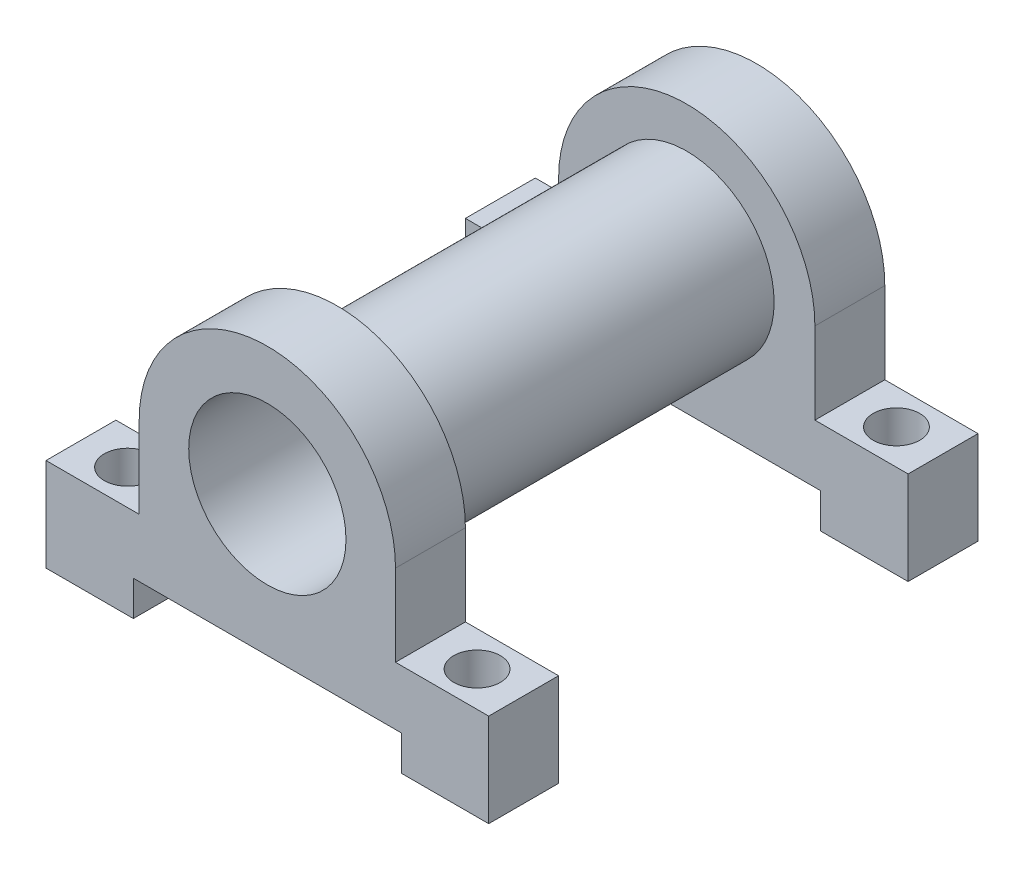
ISO-10303-21;
HEADER;
FILE_DESCRIPTION(('STEP AP214'),'2;1');
FILE_NAME('part.step','',(''),(''),'','','');
FILE_SCHEMA(('AUTOMOTIVE_DESIGN { 1 0 10303 214 1 1 1 1 }'));
ENDSEC;
DATA;
#1=APPLICATION_CONTEXT('core data for automotive mechanical design processes');
#2=APPLICATION_PROTOCOL_DEFINITION('international standard','automotive_design',2000,#1);
#3=PRODUCT_CONTEXT('',#1,'mechanical');
#4=PRODUCT('Part','Part','',(#3));
#5=PRODUCT_RELATED_PRODUCT_CATEGORY('part','',(#4));
#6=PRODUCT_DEFINITION_FORMATION('','',#4);
#7=PRODUCT_DEFINITION_CONTEXT('part definition',#1,'design');
#8=PRODUCT_DEFINITION('design','',#6,#7);
#9=PRODUCT_DEFINITION_SHAPE('','',#8);
#10=(LENGTH_UNIT() NAMED_UNIT(*) SI_UNIT(.MILLI.,.METRE.));
#11=(NAMED_UNIT(*) PLANE_ANGLE_UNIT() SI_UNIT($,.RADIAN.));
#12=(NAMED_UNIT(*) SI_UNIT($,.STERADIAN.) SOLID_ANGLE_UNIT());
#13=UNCERTAINTY_MEASURE_WITH_UNIT(LENGTH_MEASURE(1.E-05),#10,'distance_accuracy_value','');
#14=(GEOMETRIC_REPRESENTATION_CONTEXT(3) GLOBAL_UNCERTAINTY_ASSIGNED_CONTEXT((#13)) GLOBAL_UNIT_ASSIGNED_CONTEXT((#10,
#11,#12)) REPRESENTATION_CONTEXT('',''));
#15=CARTESIAN_POINT('',(0.,0.,0.));
#16=DIRECTION('',(0.,0.,1.));
#17=DIRECTION('',(1.,0.,0.));
#18=AXIS2_PLACEMENT_3D('',#15,#16,#17);
#19=CARTESIAN_POINT('',(11.,-15.,6.));
#20=DIRECTION('',(0.,1.,0.));
#21=DIRECTION('',(-1.,0.,0.));
#22=AXIS2_PLACEMENT_3D('',#19,#20,#21);
#23=PLANE('',#22);
#24=CARTESIAN_POINT('',(15.,-15.,3.));
#25=DIRECTION('',(0.,1.,0.));
#26=DIRECTION('',(0.,0.,1.));
#27=AXIS2_PLACEMENT_3D('',#24,#25,#26);
#28=CIRCLE('',#27,2.);
#29=CARTESIAN_POINT('',(15.,-15.,5.));
#30=VERTEX_POINT('',#29);
#31=EDGE_CURVE('E417',#30,#30,#28,.T.);
#32=ORIENTED_EDGE('',*,*,#31,.T.);
#33=EDGE_LOOP('',(#32));
#34=FACE_BOUND('',#33,.T.);
#35=DIRECTION('',(1.,0.,0.));
#36=VECTOR('',#35,1.);
#37=CARTESIAN_POINT('',(-11.,-15.,6.));
#38=LINE('',#37,#36);
#39=CARTESIAN_POINT('',(11.5,-15.,6.));
#40=VERTEX_POINT('',#39);
#41=CARTESIAN_POINT('',(19.,-15.,6.));
#42=VERTEX_POINT('',#41);
#43=EDGE_CURVE('E294',#40,#42,#38,.T.);
#44=ORIENTED_EDGE('',*,*,#43,.F.);
#45=DIRECTION('',(0.,0.,-1.));
#46=VECTOR('',#45,1.);
#47=CARTESIAN_POINT('',(11.5,-15.,42.));
#48=LINE('',#47,#46);
#49=CARTESIAN_POINT('',(11.5,-15.,0.));
#50=VERTEX_POINT('',#49);
#51=EDGE_CURVE('E207',#40,#50,#48,.T.);
#52=ORIENTED_EDGE('',*,*,#51,.T.);
#53=DIRECTION('',(1.,0.,0.));
#54=VECTOR('',#53,1.);
#55=CARTESIAN_POINT('',(11.,-15.,0.));
#56=LINE('',#55,#54);
#57=CARTESIAN_POINT('',(19.,-15.,0.));
#58=VERTEX_POINT('',#57);
#59=EDGE_CURVE('E314',#50,#58,#56,.T.);
#60=ORIENTED_EDGE('',*,*,#59,.T.);
#61=DIRECTION('',(0.,0.,-1.));
#62=VECTOR('',#61,1.);
#63=CARTESIAN_POINT('',(19.,-15.,6.));
#64=LINE('',#63,#62);
#65=EDGE_CURVE('E346',#42,#58,#64,.T.);
#66=ORIENTED_EDGE('',*,*,#65,.F.);
#67=EDGE_LOOP('',(#44,#52,#60,#66));
#68=FACE_BOUND('',#67,.T.);
#69=ADVANCED_FACE('F37',(#34,#68),#23,.F.);
#70=CARTESIAN_POINT('',(-19.,-15.,42.));
#71=DIRECTION('',(0.,1.,0.));
#72=DIRECTION('',(0.,0.,1.));
#73=AXIS2_PLACEMENT_3D('',#70,#71,#72);
#74=PLANE('',#73);
#75=CARTESIAN_POINT('',(15.0000000000002,-15.,39.));
#76=DIRECTION('',(0.,1.,0.));
#77=DIRECTION('',(0.,0.,1.));
#78=AXIS2_PLACEMENT_3D('',#75,#76,#77);
#79=CIRCLE('',#78,2.);
#80=CARTESIAN_POINT('',(15.0000000000002,-15.,41.));
#81=VERTEX_POINT('',#80);
#82=EDGE_CURVE('E422',#81,#81,#79,.T.);
#83=ORIENTED_EDGE('',*,*,#82,.T.);
#84=EDGE_LOOP('',(#83));
#85=FACE_BOUND('',#84,.T.);
#86=DIRECTION('',(1.,0.,0.));
#87=VECTOR('',#86,1.);
#88=CARTESIAN_POINT('',(-19.,-15.,42.));
#89=LINE('',#88,#87);
#90=CARTESIAN_POINT('',(11.5,-15.,42.));
#91=VERTEX_POINT('',#90);
#92=CARTESIAN_POINT('',(19.,-15.,42.));
#93=VERTEX_POINT('',#92);
#94=EDGE_CURVE('E212',#91,#93,#89,.T.);
#95=ORIENTED_EDGE('',*,*,#94,.F.);
#96=CARTESIAN_POINT('',(11.5,-15.,36.));
#97=VERTEX_POINT('',#96);
#98=EDGE_CURVE('E198',#91,#97,#48,.T.);
#99=ORIENTED_EDGE('',*,*,#98,.T.);
#100=DIRECTION('',(1.,0.,0.));
#101=VECTOR('',#100,1.);
#102=CARTESIAN_POINT('',(-19.,-15.,36.));
#103=LINE('',#102,#101);
#104=CARTESIAN_POINT('',(19.,-15.,36.));
#105=VERTEX_POINT('',#104);
#106=EDGE_CURVE('E249',#97,#105,#103,.T.);
#107=ORIENTED_EDGE('',*,*,#106,.T.);
#108=DIRECTION('',(0.,0.,-1.));
#109=VECTOR('',#108,1.);
#110=CARTESIAN_POINT('',(19.,-15.,42.));
#111=LINE('',#110,#109);
#112=EDGE_CURVE('E222',#93,#105,#111,.T.);
#113=ORIENTED_EDGE('',*,*,#112,.F.);
#114=EDGE_LOOP('',(#95,#99,#107,#113));
#115=FACE_BOUND('',#114,.T.);
#116=ADVANCED_FACE('F220',(#85,#115),#74,.F.);
#117=CARTESIAN_POINT('',(-19.,-15.,6.));
#118=DIRECTION('',(1.,0.,0.));
#119=DIRECTION('',(0.,0.,-1.));
#120=AXIS2_PLACEMENT_3D('',#117,#118,#119);
#121=PLANE('',#120);
#122=DIRECTION('',(0.,-1.,0.));
#123=VECTOR('',#122,1.);
#124=CARTESIAN_POINT('',(-19.,-15.,0.));
#125=LINE('',#124,#123);
#126=CARTESIAN_POINT('',(-19.,-7.,0.));
#127=VERTEX_POINT('',#126);
#128=CARTESIAN_POINT('',(-19.,-15.,0.));
#129=VERTEX_POINT('',#128);
#130=EDGE_CURVE('E288',#127,#129,#125,.T.);
#131=ORIENTED_EDGE('',*,*,#130,.T.);
#132=DIRECTION('',(0.,0.,-1.));
#133=VECTOR('',#132,1.);
#134=CARTESIAN_POINT('',(-19.,-15.,6.));
#135=LINE('',#134,#133);
#136=CARTESIAN_POINT('',(-19.,-15.,6.));
#137=VERTEX_POINT('',#136);
#138=EDGE_CURVE('E349',#137,#129,#135,.T.);
#139=ORIENTED_EDGE('',*,*,#138,.F.);
#140=DIRECTION('',(0.,-1.,0.));
#141=VECTOR('',#140,1.);
#142=CARTESIAN_POINT('',(-19.,-15.,6.));
#143=LINE('',#142,#141);
#144=CARTESIAN_POINT('',(-19.,-7.,6.));
#145=VERTEX_POINT('',#144);
#146=EDGE_CURVE('E291',#145,#137,#143,.T.);
#147=ORIENTED_EDGE('',*,*,#146,.F.);
#148=DIRECTION('',(0.,0.,-1.));
#149=VECTOR('',#148,1.);
#150=CARTESIAN_POINT('',(-19.,-7.,6.));
#151=LINE('',#150,#149);
#152=EDGE_CURVE('E311',#145,#127,#151,.T.);
#153=ORIENTED_EDGE('',*,*,#152,.T.);
#154=EDGE_LOOP('',(#131,#139,#147,#153));
#155=FACE_BOUND('',#154,.T.);
#156=ADVANCED_FACE('F39',(#155),#121,.F.);
#157=CARTESIAN_POINT('',(-15.,-15.,3.00000000000031));
#158=DIRECTION('',(0.,1.,0.));
#159=DIRECTION('',(0.,0.,1.));
#160=AXIS2_PLACEMENT_3D('',#157,#158,#159);
#161=CIRCLE('',#160,2.);
#162=CARTESIAN_POINT('',(-15.,-15.,5.00000000000031));
#163=VERTEX_POINT('',#162);
#164=EDGE_CURVE('E218',#163,#163,#161,.T.);
#165=ORIENTED_EDGE('',*,*,#164,.T.);
#166=EDGE_LOOP('',(#165));
#167=FACE_BOUND('',#166,.T.);
#168=CARTESIAN_POINT('',(-11.5,-15.,0.));
#169=VERTEX_POINT('',#168);
#170=EDGE_CURVE('E315',#129,#169,#56,.T.);
#171=ORIENTED_EDGE('',*,*,#170,.T.);
#172=DIRECTION('',(0.,0.,-1.));
#173=VECTOR('',#172,1.);
#174=CARTESIAN_POINT('',(-11.5,-15.,42.));
#175=LINE('',#174,#173);
#176=CARTESIAN_POINT('',(-11.5,-15.,6.));
#177=VERTEX_POINT('',#176);
#178=EDGE_CURVE('E52',#177,#169,#175,.T.);
#179=ORIENTED_EDGE('',*,*,#178,.F.);
#180=EDGE_CURVE('E296',#137,#177,#38,.T.);
#181=ORIENTED_EDGE('',*,*,#180,.F.);
#182=ORIENTED_EDGE('',*,*,#138,.T.);
#183=EDGE_LOOP('',(#171,#179,#181,#182));
#184=FACE_BOUND('',#183,.T.);
#185=ADVANCED_FACE('F464',(#167,#184),#23,.F.);
#186=CARTESIAN_POINT('',(19.,-15.,6.));
#187=DIRECTION('',(-1.,0.,0.));
#188=DIRECTION('',(0.,0.,1.));
#189=AXIS2_PLACEMENT_3D('',#186,#187,#188);
#190=PLANE('',#189);
#191=DIRECTION('',(0.,1.,0.));
#192=VECTOR('',#191,1.);
#193=CARTESIAN_POINT('',(19.,-15.,0.));
#194=LINE('',#193,#192);
#195=CARTESIAN_POINT('',(19.,-7.,0.));
#196=VERTEX_POINT('',#195);
#197=EDGE_CURVE('E318',#58,#196,#194,.T.);
#198=ORIENTED_EDGE('',*,*,#197,.T.);
#199=DIRECTION('',(0.,0.,-1.));
#200=VECTOR('',#199,1.);
#201=CARTESIAN_POINT('',(19.,-7.,6.));
#202=LINE('',#201,#200);
#203=CARTESIAN_POINT('',(19.,-7.,6.));
#204=VERTEX_POINT('',#203);
#205=EDGE_CURVE('E343',#204,#196,#202,.T.);
#206=ORIENTED_EDGE('',*,*,#205,.F.);
#207=DIRECTION('',(0.,1.,0.));
#208=VECTOR('',#207,1.);
#209=CARTESIAN_POINT('',(19.,-15.,6.));
#210=LINE('',#209,#208);
#211=EDGE_CURVE('E299',#42,#204,#210,.T.);
#212=ORIENTED_EDGE('',*,*,#211,.F.);
#213=ORIENTED_EDGE('',*,*,#65,.T.);
#214=EDGE_LOOP('',(#198,#206,#212,#213));
#215=FACE_BOUND('',#214,.T.);
#216=ADVANCED_FACE('F473',(#215),#190,.F.);
#217=CARTESIAN_POINT('',(11.,-7.,6.));
#218=DIRECTION('',(0.,-1.,0.));
#219=DIRECTION('',(0.,0.,-1.));
#220=AXIS2_PLACEMENT_3D('',#217,#218,#219);
#221=PLANE('',#220);
#222=CARTESIAN_POINT('',(15.,-7.,3.));
#223=DIRECTION('',(0.,1.,0.));
#224=DIRECTION('',(0.,0.,1.));
#225=AXIS2_PLACEMENT_3D('',#222,#223,#224);
#226=CIRCLE('',#225,2.);
#227=CARTESIAN_POINT('',(15.,-7.,5.));
#228=VERTEX_POINT('',#227);
#229=EDGE_CURVE('E407',#228,#228,#226,.T.);
#230=ORIENTED_EDGE('',*,*,#229,.F.);
#231=EDGE_LOOP('',(#230));
#232=FACE_BOUND('',#231,.T.);
#233=DIRECTION('',(-1.,0.,0.));
#234=VECTOR('',#233,1.);
#235=CARTESIAN_POINT('',(11.,-7.,0.));
#236=LINE('',#235,#234);
#237=CARTESIAN_POINT('',(11.,-7.,0.));
#238=VERTEX_POINT('',#237);
#239=EDGE_CURVE('E320',#196,#238,#236,.T.);
#240=ORIENTED_EDGE('',*,*,#239,.T.);
#241=DIRECTION('',(0.,0.,-1.));
#242=VECTOR('',#241,1.);
#243=CARTESIAN_POINT('',(11.,-7.,6.));
#244=LINE('',#243,#242);
#245=CARTESIAN_POINT('',(11.,-7.,6.));
#246=VERTEX_POINT('',#245);
#247=EDGE_CURVE('E340',#246,#238,#244,.T.);
#248=ORIENTED_EDGE('',*,*,#247,.F.);
#249=DIRECTION('',(-1.,0.,0.));
#250=VECTOR('',#249,1.);
#251=CARTESIAN_POINT('',(11.,-7.,6.));
#252=LINE('',#251,#250);
#253=EDGE_CURVE('E301',#204,#246,#252,.T.);
#254=ORIENTED_EDGE('',*,*,#253,.F.);
#255=ORIENTED_EDGE('',*,*,#205,.T.);
#256=EDGE_LOOP('',(#240,#248,#254,#255));
#257=FACE_BOUND('',#256,.T.);
#258=ADVANCED_FACE('F479',(#232,#257),#221,.F.);
#259=CARTESIAN_POINT('',(11.,-7.,6.));
#260=DIRECTION('',(-1.,0.,0.));
#261=DIRECTION('',(0.,0.,1.));
#262=AXIS2_PLACEMENT_3D('',#259,#260,#261);
#263=PLANE('',#262);
#264=DIRECTION('',(0.,1.,0.));
#265=VECTOR('',#264,1.);
#266=CARTESIAN_POINT('',(11.,-7.,0.));
#267=LINE('',#266,#265);
#268=CARTESIAN_POINT('',(11.,0.,0.));
#269=VERTEX_POINT('',#268);
#270=EDGE_CURVE('E322',#238,#269,#267,.T.);
#271=ORIENTED_EDGE('',*,*,#270,.T.);
#272=DIRECTION('',(0.,0.,-1.));
#273=VECTOR('',#272,1.);
#274=CARTESIAN_POINT('',(11.,0.,6.));
#275=LINE('',#274,#273);
#276=CARTESIAN_POINT('',(11.,0.,6.));
#277=VERTEX_POINT('',#276);
#278=EDGE_CURVE('E337',#277,#269,#275,.T.);
#279=ORIENTED_EDGE('',*,*,#278,.F.);
#280=DIRECTION('',(0.,1.,0.));
#281=VECTOR('',#280,1.);
#282=CARTESIAN_POINT('',(11.,-7.,6.));
#283=LINE('',#282,#281);
#284=EDGE_CURVE('E303',#246,#277,#283,.T.);
#285=ORIENTED_EDGE('',*,*,#284,.F.);
#286=ORIENTED_EDGE('',*,*,#247,.T.);
#287=EDGE_LOOP('',(#271,#279,#285,#286));
#288=FACE_BOUND('',#287,.T.);
#289=ADVANCED_FACE('F522',(#288),#263,.F.);
#290=CARTESIAN_POINT('',(0.,0.,6.));
#291=DIRECTION('',(0.,0.,-1.));
#292=DIRECTION('',(-1.,0.,0.));
#293=AXIS2_PLACEMENT_3D('',#290,#291,#292);
#294=CYLINDRICAL_SURFACE('',#293,11.);
#295=CARTESIAN_POINT('',(0.,0.,0.));
#296=DIRECTION('',(0.,0.,1.));
#297=DIRECTION('',(1.,0.,0.));
#298=AXIS2_PLACEMENT_3D('',#295,#296,#297);
#299=CIRCLE('',#298,11.);
#300=CARTESIAN_POINT('',(-11.,0.,0.));
#301=VERTEX_POINT('',#300);
#302=EDGE_CURVE('E324',#269,#301,#299,.T.);
#303=ORIENTED_EDGE('',*,*,#302,.T.);
#304=DIRECTION('',(0.,0.,-1.));
#305=VECTOR('',#304,1.);
#306=CARTESIAN_POINT('',(-11.,0.,6.));
#307=LINE('',#306,#305);
#308=CARTESIAN_POINT('',(-11.,0.,6.));
#309=VERTEX_POINT('',#308);
#310=EDGE_CURVE('E334',#309,#301,#307,.T.);
#311=ORIENTED_EDGE('',*,*,#310,.F.);
#312=CARTESIAN_POINT('',(0.,0.,6.));
#313=DIRECTION('',(0.,0.,1.));
#314=DIRECTION('',(1.,0.,0.));
#315=AXIS2_PLACEMENT_3D('',#312,#313,#314);
#316=CIRCLE('',#315,11.);
#317=EDGE_CURVE('E305',#277,#309,#316,.T.);
#318=ORIENTED_EDGE('',*,*,#317,.F.);
#319=ORIENTED_EDGE('',*,*,#278,.T.);
#320=EDGE_LOOP('',(#303,#311,#318,#319));
#321=FACE_BOUND('',#320,.T.);
#322=ADVANCED_FACE('F518',(#321),#294,.T.);
#323=CARTESIAN_POINT('',(-11.,0.,6.));
#324=DIRECTION('',(1.,0.,0.));
#325=DIRECTION('',(0.,0.,-1.));
#326=AXIS2_PLACEMENT_3D('',#323,#324,#325);
#327=PLANE('',#326);
#328=DIRECTION('',(0.,-1.,0.));
#329=VECTOR('',#328,1.);
#330=CARTESIAN_POINT('',(-11.,0.,0.));
#331=LINE('',#330,#329);
#332=CARTESIAN_POINT('',(-11.,-7.,0.));
#333=VERTEX_POINT('',#332);
#334=EDGE_CURVE('E326',#301,#333,#331,.T.);
#335=ORIENTED_EDGE('',*,*,#334,.T.);
#336=DIRECTION('',(0.,0.,-1.));
#337=VECTOR('',#336,1.);
#338=CARTESIAN_POINT('',(-11.,-7.,6.));
#339=LINE('',#338,#337);
#340=CARTESIAN_POINT('',(-11.,-7.,6.));
#341=VERTEX_POINT('',#340);
#342=EDGE_CURVE('E331',#341,#333,#339,.T.);
#343=ORIENTED_EDGE('',*,*,#342,.F.);
#344=DIRECTION('',(0.,-1.,0.));
#345=VECTOR('',#344,1.);
#346=CARTESIAN_POINT('',(-11.,0.,6.));
#347=LINE('',#346,#345);
#348=EDGE_CURVE('E307',#309,#341,#347,.T.);
#349=ORIENTED_EDGE('',*,*,#348,.F.);
#350=ORIENTED_EDGE('',*,*,#310,.T.);
#351=EDGE_LOOP('',(#335,#343,#349,#350));
#352=FACE_BOUND('',#351,.T.);
#353=ADVANCED_FACE('F513',(#352),#327,.F.);
#354=CARTESIAN_POINT('',(-11.,-7.,6.));
#355=DIRECTION('',(0.,-1.,0.));
#356=DIRECTION('',(0.,0.,-1.));
#357=AXIS2_PLACEMENT_3D('',#354,#355,#356);
#358=PLANE('',#357);
#359=CARTESIAN_POINT('',(-15.,-7.,3.00000000000031));
#360=DIRECTION('',(0.,1.,0.));
#361=DIRECTION('',(0.,0.,1.));
#362=AXIS2_PLACEMENT_3D('',#359,#360,#361);
#363=CIRCLE('',#362,2.);
#364=CARTESIAN_POINT('',(-15.,-7.,5.00000000000031));
#365=VERTEX_POINT('',#364);
#366=EDGE_CURVE('E404',#365,#365,#363,.T.);
#367=ORIENTED_EDGE('',*,*,#366,.F.);
#368=EDGE_LOOP('',(#367));
#369=FACE_BOUND('',#368,.T.);
#370=DIRECTION('',(-1.,0.,0.));
#371=VECTOR('',#370,1.);
#372=CARTESIAN_POINT('',(-11.,-7.,0.));
#373=LINE('',#372,#371);
#374=EDGE_CURVE('E295',#333,#127,#373,.T.);
#375=ORIENTED_EDGE('',*,*,#374,.T.);
#376=ORIENTED_EDGE('',*,*,#152,.F.);
#377=DIRECTION('',(-1.,0.,0.));
#378=VECTOR('',#377,1.);
#379=CARTESIAN_POINT('',(-11.,-7.,6.));
#380=LINE('',#379,#378);
#381=EDGE_CURVE('E309',#341,#145,#380,.T.);
#382=ORIENTED_EDGE('',*,*,#381,.F.);
#383=ORIENTED_EDGE('',*,*,#342,.T.);
#384=EDGE_LOOP('',(#375,#376,#382,#383));
#385=FACE_BOUND('',#384,.T.);
#386=ADVANCED_FACE('F507',(#369,#385),#358,.F.);
#387=CARTESIAN_POINT('',(0.,0.,6.));
#388=DIRECTION('',(0.,0.,1.));
#389=DIRECTION('',(1.,0.,0.));
#390=AXIS2_PLACEMENT_3D('',#387,#388,#389);
#391=PLANE('',#390);
#392=DIRECTION('',(0.,1.,0.));
#393=VECTOR('',#392,1.);
#394=CARTESIAN_POINT('',(11.5,0.,6.));
#395=LINE('',#394,#393);
#396=CARTESIAN_POINT('',(11.5,-12.,6.));
#397=VERTEX_POINT('',#396);
#398=EDGE_CURVE('E383',#40,#397,#395,.T.);
#399=ORIENTED_EDGE('',*,*,#398,.F.);
#400=ORIENTED_EDGE('',*,*,#43,.T.);
#401=ORIENTED_EDGE('',*,*,#211,.T.);
#402=ORIENTED_EDGE('',*,*,#253,.T.);
#403=ORIENTED_EDGE('',*,*,#284,.T.);
#404=ORIENTED_EDGE('',*,*,#317,.T.);
#405=ORIENTED_EDGE('',*,*,#348,.T.);
#406=ORIENTED_EDGE('',*,*,#381,.T.);
#407=ORIENTED_EDGE('',*,*,#146,.T.);
#408=ORIENTED_EDGE('',*,*,#180,.T.);
#409=DIRECTION('',(0.,-1.,0.));
#410=VECTOR('',#409,1.);
#411=CARTESIAN_POINT('',(-11.5,0.,6.));
#412=LINE('',#411,#410);
#413=CARTESIAN_POINT('',(-11.5,-12.,6.));
#414=VERTEX_POINT('',#413);
#415=EDGE_CURVE('E365',#414,#177,#412,.T.);
#416=ORIENTED_EDGE('',*,*,#415,.F.);
#417=DIRECTION('',(-1.,0.,0.));
#418=VECTOR('',#417,1.);
#419=CARTESIAN_POINT('',(0.,-12.,6.));
#420=LINE('',#419,#418);
#421=EDGE_CURVE('E378',#397,#414,#420,.T.);
#422=ORIENTED_EDGE('',*,*,#421,.F.);
#423=EDGE_LOOP('',(#399,#400,#401,#402,#403,#404,#405,#406,#407,#408,#416,#422));
#424=FACE_BOUND('',#423,.T.);
#425=CARTESIAN_POINT('',(0.,0.,6.));
#426=DIRECTION('',(0.,0.,1.));
#427=DIRECTION('',(1.,0.,0.));
#428=AXIS2_PLACEMENT_3D('',#425,#426,#427);
#429=CIRCLE('',#428,7.5);
#430=CARTESIAN_POINT('',(7.5,0.,6.));
#431=VERTEX_POINT('',#430);
#432=EDGE_CURVE('E284',#431,#431,#429,.T.);
#433=ORIENTED_EDGE('',*,*,#432,.F.);
#434=EDGE_LOOP('',(#433));
#435=FACE_BOUND('',#434,.T.);
#436=ADVANCED_FACE('F500',(#424,#435),#391,.T.);
#437=CARTESIAN_POINT('',(0.,0.,0.));
#438=DIRECTION('',(0.,0.,1.));
#439=DIRECTION('',(1.,0.,0.));
#440=AXIS2_PLACEMENT_3D('',#437,#438,#439);
#441=PLANE('',#440);
#442=CARTESIAN_POINT('',(0.,0.,0.));
#443=DIRECTION('',(0.,0.,1.));
#444=DIRECTION('',(1.,0.,0.));
#445=AXIS2_PLACEMENT_3D('',#442,#443,#444);
#446=CIRCLE('',#445,6.75);
#447=CARTESIAN_POINT('',(6.75,0.,0.));
#448=VERTEX_POINT('',#447);
#449=EDGE_CURVE('E247',#448,#448,#446,.T.);
#450=ORIENTED_EDGE('',*,*,#449,.T.);
#451=EDGE_LOOP('',(#450));
#452=FACE_BOUND('',#451,.T.);
#453=ORIENTED_EDGE('',*,*,#59,.F.);
#454=DIRECTION('',(0.,1.,0.));
#455=VECTOR('',#454,1.);
#456=CARTESIAN_POINT('',(11.5,0.,0.));
#457=LINE('',#456,#455);
#458=CARTESIAN_POINT('',(11.5,-12.,0.));
#459=VERTEX_POINT('',#458);
#460=EDGE_CURVE('E380',#50,#459,#457,.T.);
#461=ORIENTED_EDGE('',*,*,#460,.T.);
#462=DIRECTION('',(-1.,0.,0.));
#463=VECTOR('',#462,1.);
#464=CARTESIAN_POINT('',(0.,-12.,0.));
#465=LINE('',#464,#463);
#466=CARTESIAN_POINT('',(-11.5,-12.,0.));
#467=VERTEX_POINT('',#466);
#468=EDGE_CURVE('E375',#459,#467,#465,.T.);
#469=ORIENTED_EDGE('',*,*,#468,.T.);
#470=DIRECTION('',(0.,-1.,0.));
#471=VECTOR('',#470,1.);
#472=CARTESIAN_POINT('',(-11.5,0.,0.));
#473=LINE('',#472,#471);
#474=EDGE_CURVE('E362',#467,#169,#473,.T.);
#475=ORIENTED_EDGE('',*,*,#474,.T.);
#476=ORIENTED_EDGE('',*,*,#170,.F.);
#477=ORIENTED_EDGE('',*,*,#130,.F.);
#478=ORIENTED_EDGE('',*,*,#374,.F.);
#479=ORIENTED_EDGE('',*,*,#334,.F.);
#480=ORIENTED_EDGE('',*,*,#302,.F.);
#481=ORIENTED_EDGE('',*,*,#270,.F.);
#482=ORIENTED_EDGE('',*,*,#239,.F.);
#483=ORIENTED_EDGE('',*,*,#197,.F.);
#484=EDGE_LOOP('',(#453,#461,#469,#475,#476,#477,#478,#479,#480,#481,#482,#483));
#485=FACE_BOUND('',#484,.T.);
#486=ADVANCED_FACE('F488',(#452,#485),#441,.F.);
#487=CARTESIAN_POINT('',(0.,0.,36.));
#488=DIRECTION('',(0.,0.,-1.));
#489=DIRECTION('',(-1.,0.,0.));
#490=AXIS2_PLACEMENT_3D('',#487,#488,#489);
#491=CYLINDRICAL_SURFACE('',#490,7.5);
#492=CARTESIAN_POINT('',(0.,0.,36.));
#493=DIRECTION('',(0.,0.,1.));
#494=DIRECTION('',(1.,0.,0.));
#495=AXIS2_PLACEMENT_3D('',#492,#493,#494);
#496=CIRCLE('',#495,7.5);
#497=CARTESIAN_POINT('',(7.5,0.,36.));
#498=VERTEX_POINT('',#497);
#499=EDGE_CURVE('E285',#498,#498,#496,.T.);
#500=ORIENTED_EDGE('',*,*,#499,.F.);
#501=EDGE_LOOP('',(#500));
#502=FACE_BOUND('',#501,.T.);
#503=ORIENTED_EDGE('',*,*,#432,.T.);
#504=EDGE_LOOP('',(#503));
#505=FACE_BOUND('',#504,.T.);
#506=ADVANCED_FACE('F553',(#502,#505),#491,.T.);
#507=CARTESIAN_POINT('',(-11.,-7.,42.));
#508=DIRECTION('',(0.,-1.,0.));
#509=DIRECTION('',(0.,0.,-1.));
#510=AXIS2_PLACEMENT_3D('',#507,#508,#509);
#511=PLANE('',#510);
#512=CARTESIAN_POINT('',(-14.9999999999996,-7.,39.0000000000003));
#513=DIRECTION('',(0.,1.,0.));
#514=DIRECTION('',(0.,0.,1.));
#515=AXIS2_PLACEMENT_3D('',#512,#513,#514);
#516=CIRCLE('',#515,2.);
#517=CARTESIAN_POINT('',(-14.9999999999996,-7.,41.0000000000003));
#518=VERTEX_POINT('',#517);
#519=EDGE_CURVE('E413',#518,#518,#516,.T.);
#520=ORIENTED_EDGE('',*,*,#519,.F.);
#521=EDGE_LOOP('',(#520));
#522=FACE_BOUND('',#521,.T.);
#523=DIRECTION('',(-1.,0.,0.));
#524=VECTOR('',#523,1.);
#525=CARTESIAN_POINT('',(-11.,-7.,36.));
#526=LINE('',#525,#524);
#527=CARTESIAN_POINT('',(-11.,-7.,36.));
#528=VERTEX_POINT('',#527);
#529=CARTESIAN_POINT('',(-19.,-7.,36.));
#530=VERTEX_POINT('',#529);
#531=EDGE_CURVE('E243',#528,#530,#526,.T.);
#532=ORIENTED_EDGE('',*,*,#531,.T.);
#533=DIRECTION('',(0.,0.,-1.));
#534=VECTOR('',#533,1.);
#535=CARTESIAN_POINT('',(-19.,-7.,42.));
#536=LINE('',#535,#534);
#537=CARTESIAN_POINT('',(-19.,-7.,42.));
#538=VERTEX_POINT('',#537);
#539=EDGE_CURVE('E281',#538,#530,#536,.T.);
#540=ORIENTED_EDGE('',*,*,#539,.F.);
#541=DIRECTION('',(-1.,0.,0.));
#542=VECTOR('',#541,1.);
#543=CARTESIAN_POINT('',(-11.,-7.,42.));
#544=LINE('',#543,#542);
#545=CARTESIAN_POINT('',(-11.,-7.,42.));
#546=VERTEX_POINT('',#545);
#547=EDGE_CURVE('E229',#546,#538,#544,.T.);
#548=ORIENTED_EDGE('',*,*,#547,.F.);
#549=DIRECTION('',(0.,0.,-1.));
#550=VECTOR('',#549,1.);
#551=CARTESIAN_POINT('',(-11.,-7.,42.));
#552=LINE('',#551,#550);
#553=EDGE_CURVE('E242',#546,#528,#552,.T.);
#554=ORIENTED_EDGE('',*,*,#553,.T.);
#555=EDGE_LOOP('',(#532,#540,#548,#554));
#556=FACE_BOUND('',#555,.T.);
#557=ADVANCED_FACE('F396',(#522,#556),#511,.F.);
#558=CARTESIAN_POINT('',(-19.,-7.,42.));
#559=DIRECTION('',(1.,0.,0.));
#560=DIRECTION('',(0.,0.,-1.));
#561=AXIS2_PLACEMENT_3D('',#558,#559,#560);
#562=PLANE('',#561);
#563=DIRECTION('',(0.,-1.,0.));
#564=VECTOR('',#563,1.);
#565=CARTESIAN_POINT('',(-19.,-7.,36.));
#566=LINE('',#565,#564);
#567=CARTESIAN_POINT('',(-19.,-15.,36.));
#568=VERTEX_POINT('',#567);
#569=EDGE_CURVE('E246',#530,#568,#566,.T.);
#570=ORIENTED_EDGE('',*,*,#569,.T.);
#571=DIRECTION('',(0.,0.,-1.));
#572=VECTOR('',#571,1.);
#573=CARTESIAN_POINT('',(-19.,-15.,42.));
#574=LINE('',#573,#572);
#575=CARTESIAN_POINT('',(-19.,-15.,42.));
#576=VERTEX_POINT('',#575);
#577=EDGE_CURVE('E278',#576,#568,#574,.T.);
#578=ORIENTED_EDGE('',*,*,#577,.F.);
#579=DIRECTION('',(0.,-1.,0.));
#580=VECTOR('',#579,1.);
#581=CARTESIAN_POINT('',(-19.,-7.,42.));
#582=LINE('',#581,#580);
#583=EDGE_CURVE('E225',#538,#576,#582,.T.);
#584=ORIENTED_EDGE('',*,*,#583,.F.);
#585=ORIENTED_EDGE('',*,*,#539,.T.);
#586=EDGE_LOOP('',(#570,#578,#584,#585));
#587=FACE_BOUND('',#586,.T.);
#588=ADVANCED_FACE('F399',(#587),#562,.F.);
#589=CARTESIAN_POINT('',(-14.9999999999996,-15.,39.0000000000003));
#590=DIRECTION('',(0.,1.,0.));
#591=DIRECTION('',(0.,0.,1.));
#592=AXIS2_PLACEMENT_3D('',#589,#590,#591);
#593=CIRCLE('',#592,2.);
#594=CARTESIAN_POINT('',(-14.9999999999996,-15.,41.0000000000003));
#595=VERTEX_POINT('',#594);
#596=EDGE_CURVE('E410',#595,#595,#593,.T.);
#597=ORIENTED_EDGE('',*,*,#596,.T.);
#598=EDGE_LOOP('',(#597));
#599=FACE_BOUND('',#598,.T.);
#600=CARTESIAN_POINT('',(-11.5,-15.,36.));
#601=VERTEX_POINT('',#600);
#602=EDGE_CURVE('E250',#568,#601,#103,.T.);
#603=ORIENTED_EDGE('',*,*,#602,.T.);
#604=CARTESIAN_POINT('',(-11.5,-15.,42.));
#605=VERTEX_POINT('',#604);
#606=EDGE_CURVE('E60',#605,#601,#175,.T.);
#607=ORIENTED_EDGE('',*,*,#606,.F.);
#608=EDGE_CURVE('E224',#576,#605,#89,.T.);
#609=ORIENTED_EDGE('',*,*,#608,.F.);
#610=ORIENTED_EDGE('',*,*,#577,.T.);
#611=EDGE_LOOP('',(#603,#607,#609,#610));
#612=FACE_BOUND('',#611,.T.);
#613=ADVANCED_FACE('F402',(#599,#612),#74,.F.);
#614=CARTESIAN_POINT('',(19.,-15.,42.));
#615=DIRECTION('',(-1.,0.,0.));
#616=DIRECTION('',(0.,0.,1.));
#617=AXIS2_PLACEMENT_3D('',#614,#615,#616);
#618=PLANE('',#617);
#619=DIRECTION('',(0.,1.,0.));
#620=VECTOR('',#619,1.);
#621=CARTESIAN_POINT('',(19.,-15.,36.));
#622=LINE('',#621,#620);
#623=CARTESIAN_POINT('',(19.,-7.,36.));
#624=VERTEX_POINT('',#623);
#625=EDGE_CURVE('E253',#105,#624,#622,.T.);
#626=ORIENTED_EDGE('',*,*,#625,.T.);
#627=DIRECTION('',(0.,0.,-1.));
#628=VECTOR('',#627,1.);
#629=CARTESIAN_POINT('',(19.,-7.,42.));
#630=LINE('',#629,#628);
#631=CARTESIAN_POINT('',(19.,-7.,42.));
#632=VERTEX_POINT('',#631);
#633=EDGE_CURVE('E274',#632,#624,#630,.T.);
#634=ORIENTED_EDGE('',*,*,#633,.F.);
#635=DIRECTION('',(0.,1.,0.));
#636=VECTOR('',#635,1.);
#637=CARTESIAN_POINT('',(19.,-15.,42.));
#638=LINE('',#637,#636);
#639=EDGE_CURVE('E228',#93,#632,#638,.T.);
#640=ORIENTED_EDGE('',*,*,#639,.F.);
#641=ORIENTED_EDGE('',*,*,#112,.T.);
#642=EDGE_LOOP('',(#626,#634,#640,#641));
#643=FACE_BOUND('',#642,.T.);
#644=ADVANCED_FACE('F434',(#643),#618,.F.);
#645=CARTESIAN_POINT('',(19.,-7.,42.));
#646=DIRECTION('',(0.,-1.,0.));
#647=DIRECTION('',(0.,0.,-1.));
#648=AXIS2_PLACEMENT_3D('',#645,#646,#647);
#649=PLANE('',#648);
#650=CARTESIAN_POINT('',(15.0000000000002,-7.,39.));
#651=DIRECTION('',(0.,1.,0.));
#652=DIRECTION('',(0.,0.,1.));
#653=AXIS2_PLACEMENT_3D('',#650,#651,#652);
#654=CIRCLE('',#653,2.);
#655=CARTESIAN_POINT('',(15.0000000000002,-7.,41.));
#656=VERTEX_POINT('',#655);
#657=EDGE_CURVE('E414',#656,#656,#654,.T.);
#658=ORIENTED_EDGE('',*,*,#657,.F.);
#659=EDGE_LOOP('',(#658));
#660=FACE_BOUND('',#659,.T.);
#661=DIRECTION('',(-1.,0.,0.));
#662=VECTOR('',#661,1.);
#663=CARTESIAN_POINT('',(19.,-7.,36.));
#664=LINE('',#663,#662);
#665=CARTESIAN_POINT('',(11.,-7.,36.));
#666=VERTEX_POINT('',#665);
#667=EDGE_CURVE('E255',#624,#666,#664,.T.);
#668=ORIENTED_EDGE('',*,*,#667,.T.);
#669=DIRECTION('',(0.,0.,-1.));
#670=VECTOR('',#669,1.);
#671=CARTESIAN_POINT('',(11.,-7.,42.));
#672=LINE('',#671,#670);
#673=CARTESIAN_POINT('',(11.,-7.,42.));
#674=VERTEX_POINT('',#673);
#675=EDGE_CURVE('E271',#674,#666,#672,.T.);
#676=ORIENTED_EDGE('',*,*,#675,.F.);
#677=DIRECTION('',(-1.,0.,0.));
#678=VECTOR('',#677,1.);
#679=CARTESIAN_POINT('',(19.,-7.,42.));
#680=LINE('',#679,#678);
#681=EDGE_CURVE('E234',#632,#674,#680,.T.);
#682=ORIENTED_EDGE('',*,*,#681,.F.);
#683=ORIENTED_EDGE('',*,*,#633,.T.);
#684=EDGE_LOOP('',(#668,#676,#682,#683));
#685=FACE_BOUND('',#684,.T.);
#686=ADVANCED_FACE('F430',(#660,#685),#649,.F.);
#687=CARTESIAN_POINT('',(11.,-7.,42.));
#688=DIRECTION('',(-1.,0.,0.));
#689=DIRECTION('',(0.,0.,1.));
#690=AXIS2_PLACEMENT_3D('',#687,#688,#689);
#691=PLANE('',#690);
#692=DIRECTION('',(0.,1.,0.));
#693=VECTOR('',#692,1.);
#694=CARTESIAN_POINT('',(11.,-7.,36.));
#695=LINE('',#694,#693);
#696=CARTESIAN_POINT('',(11.,0.,36.));
#697=VERTEX_POINT('',#696);
#698=EDGE_CURVE('E257',#666,#697,#695,.T.);
#699=ORIENTED_EDGE('',*,*,#698,.T.);
#700=DIRECTION('',(0.,0.,-1.));
#701=VECTOR('',#700,1.);
#702=CARTESIAN_POINT('',(11.,0.,42.));
#703=LINE('',#702,#701);
#704=CARTESIAN_POINT('',(11.,0.,42.));
#705=VERTEX_POINT('',#704);
#706=EDGE_CURVE('E268',#705,#697,#703,.T.);
#707=ORIENTED_EDGE('',*,*,#706,.F.);
#708=DIRECTION('',(0.,1.,0.));
#709=VECTOR('',#708,1.);
#710=CARTESIAN_POINT('',(11.,-7.,42.));
#711=LINE('',#710,#709);
#712=EDGE_CURVE('E236',#674,#705,#711,.T.);
#713=ORIENTED_EDGE('',*,*,#712,.F.);
#714=ORIENTED_EDGE('',*,*,#675,.T.);
#715=EDGE_LOOP('',(#699,#707,#713,#714));
#716=FACE_BOUND('',#715,.T.);
#717=ADVANCED_FACE('F433',(#716),#691,.F.);
#718=CARTESIAN_POINT('',(0.,0.,42.));
#719=DIRECTION('',(0.,0.,-1.));
#720=DIRECTION('',(-1.,0.,0.));
#721=AXIS2_PLACEMENT_3D('',#718,#719,#720);
#722=CYLINDRICAL_SURFACE('',#721,11.);
#723=CARTESIAN_POINT('',(0.,0.,36.));
#724=DIRECTION('',(0.,0.,1.));
#725=DIRECTION('',(1.,0.,0.));
#726=AXIS2_PLACEMENT_3D('',#723,#724,#725);
#727=CIRCLE('',#726,11.);
#728=CARTESIAN_POINT('',(-11.,0.,36.));
#729=VERTEX_POINT('',#728);
#730=EDGE_CURVE('E259',#697,#729,#727,.T.);
#731=ORIENTED_EDGE('',*,*,#730,.T.);
#732=DIRECTION('',(0.,0.,-1.));
#733=VECTOR('',#732,1.);
#734=CARTESIAN_POINT('',(-11.,0.,42.));
#735=LINE('',#734,#733);
#736=CARTESIAN_POINT('',(-11.,0.,42.));
#737=VERTEX_POINT('',#736);
#738=EDGE_CURVE('E265',#737,#729,#735,.T.);
#739=ORIENTED_EDGE('',*,*,#738,.F.);
#740=CARTESIAN_POINT('',(0.,0.,42.));
#741=DIRECTION('',(0.,0.,1.));
#742=DIRECTION('',(1.,0.,0.));
#743=AXIS2_PLACEMENT_3D('',#740,#741,#742);
#744=CIRCLE('',#743,11.);
#745=EDGE_CURVE('E238',#705,#737,#744,.T.);
#746=ORIENTED_EDGE('',*,*,#745,.F.);
#747=ORIENTED_EDGE('',*,*,#706,.T.);
#748=EDGE_LOOP('',(#731,#739,#746,#747));
#749=FACE_BOUND('',#748,.T.);
#750=ADVANCED_FACE('F449',(#749),#722,.T.);
#751=CARTESIAN_POINT('',(-11.,0.,42.));
#752=DIRECTION('',(1.,0.,0.));
#753=DIRECTION('',(0.,0.,-1.));
#754=AXIS2_PLACEMENT_3D('',#751,#752,#753);
#755=PLANE('',#754);
#756=DIRECTION('',(0.,-1.,0.));
#757=VECTOR('',#756,1.);
#758=CARTESIAN_POINT('',(-11.,0.,36.));
#759=LINE('',#758,#757);
#760=EDGE_CURVE('E261',#729,#528,#759,.T.);
#761=ORIENTED_EDGE('',*,*,#760,.T.);
#762=ORIENTED_EDGE('',*,*,#553,.F.);
#763=DIRECTION('',(0.,-1.,0.));
#764=VECTOR('',#763,1.);
#765=CARTESIAN_POINT('',(-11.,0.,42.));
#766=LINE('',#765,#764);
#767=EDGE_CURVE('E240',#737,#546,#766,.T.);
#768=ORIENTED_EDGE('',*,*,#767,.F.);
#769=ORIENTED_EDGE('',*,*,#738,.T.);
#770=EDGE_LOOP('',(#761,#762,#768,#769));
#771=FACE_BOUND('',#770,.T.);
#772=ADVANCED_FACE('F452',(#771),#755,.F.);
#773=CARTESIAN_POINT('',(0.,0.,42.));
#774=DIRECTION('',(0.,0.,1.));
#775=DIRECTION('',(1.,0.,0.));
#776=AXIS2_PLACEMENT_3D('',#773,#774,#775);
#777=PLANE('',#776);
#778=DIRECTION('',(0.,-1.,0.));
#779=VECTOR('',#778,1.);
#780=CARTESIAN_POINT('',(11.5,-15.,42.));
#781=LINE('',#780,#779);
#782=CARTESIAN_POINT('',(11.5,-12.,42.));
#783=VERTEX_POINT('',#782);
#784=EDGE_CURVE('E202',#783,#91,#781,.T.);
#785=ORIENTED_EDGE('',*,*,#784,.T.);
#786=ORIENTED_EDGE('',*,*,#94,.T.);
#787=ORIENTED_EDGE('',*,*,#639,.T.);
#788=ORIENTED_EDGE('',*,*,#681,.T.);
#789=ORIENTED_EDGE('',*,*,#712,.T.);
#790=ORIENTED_EDGE('',*,*,#745,.T.);
#791=ORIENTED_EDGE('',*,*,#767,.T.);
#792=ORIENTED_EDGE('',*,*,#547,.T.);
#793=ORIENTED_EDGE('',*,*,#583,.T.);
#794=ORIENTED_EDGE('',*,*,#608,.T.);
#795=DIRECTION('',(0.,1.,0.));
#796=VECTOR('',#795,1.);
#797=CARTESIAN_POINT('',(-11.5,-15.,42.));
#798=LINE('',#797,#796);
#799=CARTESIAN_POINT('',(-11.5,-12.,42.));
#800=VERTEX_POINT('',#799);
#801=EDGE_CURVE('E217',#605,#800,#798,.T.);
#802=ORIENTED_EDGE('',*,*,#801,.T.);
#803=DIRECTION('',(1.,0.,0.));
#804=VECTOR('',#803,1.);
#805=CARTESIAN_POINT('',(11.5,-12.,42.));
#806=LINE('',#805,#804);
#807=EDGE_CURVE('E216',#800,#783,#806,.T.);
#808=ORIENTED_EDGE('',*,*,#807,.T.);
#809=EDGE_LOOP('',(#785,#786,#787,#788,#789,#790,#791,#792,#793,#794,#802,#808));
#810=FACE_BOUND('',#809,.T.);
#811=CARTESIAN_POINT('',(0.,0.,42.));
#812=DIRECTION('',(0.,0.,1.));
#813=DIRECTION('',(1.,0.,0.));
#814=AXIS2_PLACEMENT_3D('',#811,#812,#813);
#815=CIRCLE('',#814,6.75);
#816=CARTESIAN_POINT('',(6.75,0.,42.));
#817=VERTEX_POINT('',#816);
#818=EDGE_CURVE('E385',#817,#817,#815,.T.);
#819=ORIENTED_EDGE('',*,*,#818,.F.);
#820=EDGE_LOOP('',(#819));
#821=FACE_BOUND('',#820,.T.);
#822=ADVANCED_FACE('F210',(#810,#821),#777,.T.);
#823=CARTESIAN_POINT('',(0.,0.,36.));
#824=DIRECTION('',(0.,0.,1.));
#825=DIRECTION('',(1.,0.,0.));
#826=AXIS2_PLACEMENT_3D('',#823,#824,#825);
#827=PLANE('',#826);
#828=ORIENTED_EDGE('',*,*,#499,.T.);
#829=EDGE_LOOP('',(#828));
#830=FACE_BOUND('',#829,.T.);
#831=ORIENTED_EDGE('',*,*,#106,.F.);
#832=DIRECTION('',(0.,1.,0.));
#833=VECTOR('',#832,1.);
#834=CARTESIAN_POINT('',(11.5,0.,36.));
#835=LINE('',#834,#833);
#836=CARTESIAN_POINT('',(11.5,-12.,36.));
#837=VERTEX_POINT('',#836);
#838=EDGE_CURVE('E11',#97,#837,#835,.T.);
#839=ORIENTED_EDGE('',*,*,#838,.T.);
#840=DIRECTION('',(-1.,0.,0.));
#841=VECTOR('',#840,1.);
#842=CARTESIAN_POINT('',(0.,-12.,36.));
#843=LINE('',#842,#841);
#844=CARTESIAN_POINT('',(-11.5,-12.,36.));
#845=VERTEX_POINT('',#844);
#846=EDGE_CURVE('E45',#837,#845,#843,.T.);
#847=ORIENTED_EDGE('',*,*,#846,.T.);
#848=DIRECTION('',(0.,-1.,0.));
#849=VECTOR('',#848,1.);
#850=CARTESIAN_POINT('',(-11.5,0.,36.));
#851=LINE('',#850,#849);
#852=EDGE_CURVE('E352',#845,#601,#851,.T.);
#853=ORIENTED_EDGE('',*,*,#852,.T.);
#854=ORIENTED_EDGE('',*,*,#602,.F.);
#855=ORIENTED_EDGE('',*,*,#569,.F.);
#856=ORIENTED_EDGE('',*,*,#531,.F.);
#857=ORIENTED_EDGE('',*,*,#760,.F.);
#858=ORIENTED_EDGE('',*,*,#730,.F.);
#859=ORIENTED_EDGE('',*,*,#698,.F.);
#860=ORIENTED_EDGE('',*,*,#667,.F.);
#861=ORIENTED_EDGE('',*,*,#625,.F.);
#862=EDGE_LOOP('',(#831,#839,#847,#853,#854,#855,#856,#857,#858,#859,#860,#861));
#863=FACE_BOUND('',#862,.T.);
#864=ADVANCED_FACE('F355',(#830,#863),#827,.F.);
#865=CARTESIAN_POINT('',(0.,0.,0.));
#866=DIRECTION('',(0.,0.,1.));
#867=DIRECTION('',(1.,0.,0.));
#868=AXIS2_PLACEMENT_3D('',#865,#866,#867);
#869=CYLINDRICAL_SURFACE('',#868,6.75);
#870=ORIENTED_EDGE('',*,*,#449,.F.);
#871=EDGE_LOOP('',(#870));
#872=FACE_BOUND('',#871,.T.);
#873=ORIENTED_EDGE('',*,*,#818,.T.);
#874=EDGE_LOOP('',(#873));
#875=FACE_BOUND('',#874,.T.);
#876=ADVANCED_FACE('F543',(#872,#875),#869,.F.);
#877=CARTESIAN_POINT('',(-11.5,-15.,42.));
#878=DIRECTION('',(-1.,0.,0.));
#879=DIRECTION('',(0.,0.,1.));
#880=AXIS2_PLACEMENT_3D('',#877,#878,#879);
#881=PLANE('',#880);
#882=DIRECTION('',(0.,0.,-1.));
#883=VECTOR('',#882,1.);
#884=CARTESIAN_POINT('',(-11.5,-12.,42.));
#885=LINE('',#884,#883);
#886=EDGE_CURVE('E361',#800,#845,#885,.T.);
#887=ORIENTED_EDGE('',*,*,#886,.F.);
#888=ORIENTED_EDGE('',*,*,#801,.F.);
#889=ORIENTED_EDGE('',*,*,#606,.T.);
#890=ORIENTED_EDGE('',*,*,#852,.F.);
#891=EDGE_LOOP('',(#887,#888,#889,#890));
#892=FACE_BOUND('',#891,.T.);
#893=ADVANCED_FACE('F545',(#892),#881,.F.);
#894=CARTESIAN_POINT('',(11.5,-12.,42.));
#895=DIRECTION('',(0.,1.,0.));
#896=DIRECTION('',(0.,0.,1.));
#897=AXIS2_PLACEMENT_3D('',#894,#895,#896);
#898=PLANE('',#897);
#899=DIRECTION('',(0.,0.,-1.));
#900=VECTOR('',#899,1.);
#901=CARTESIAN_POINT('',(11.5,-12.,42.));
#902=LINE('',#901,#900);
#903=EDGE_CURVE('E360',#783,#837,#902,.T.);
#904=ORIENTED_EDGE('',*,*,#903,.F.);
#905=ORIENTED_EDGE('',*,*,#807,.F.);
#906=ORIENTED_EDGE('',*,*,#886,.T.);
#907=ORIENTED_EDGE('',*,*,#846,.F.);
#908=EDGE_LOOP('',(#904,#905,#906,#907));
#909=FACE_BOUND('',#908,.T.);
#910=ADVANCED_FACE('F359',(#909),#898,.F.);
#911=CARTESIAN_POINT('',(11.5,-15.,42.));
#912=DIRECTION('',(1.,0.,0.));
#913=DIRECTION('',(0.,0.,-1.));
#914=AXIS2_PLACEMENT_3D('',#911,#912,#913);
#915=PLANE('',#914);
#916=ORIENTED_EDGE('',*,*,#98,.F.);
#917=ORIENTED_EDGE('',*,*,#784,.F.);
#918=ORIENTED_EDGE('',*,*,#903,.T.);
#919=ORIENTED_EDGE('',*,*,#838,.F.);
#920=EDGE_LOOP('',(#916,#917,#918,#919));
#921=FACE_BOUND('',#920,.T.);
#922=ADVANCED_FACE('F200',(#921),#915,.F.);
#923=ORIENTED_EDGE('',*,*,#398,.T.);
#924=EDGE_CURVE('E363',#397,#459,#902,.T.);
#925=ORIENTED_EDGE('',*,*,#924,.T.);
#926=ORIENTED_EDGE('',*,*,#460,.F.);
#927=ORIENTED_EDGE('',*,*,#51,.F.);
#928=EDGE_LOOP('',(#923,#925,#926,#927));
#929=FACE_BOUND('',#928,.T.);
#930=ADVANCED_FACE('F533',(#929),#915,.F.);
#931=ORIENTED_EDGE('',*,*,#421,.T.);
#932=EDGE_CURVE('E372',#414,#467,#885,.T.);
#933=ORIENTED_EDGE('',*,*,#932,.T.);
#934=ORIENTED_EDGE('',*,*,#468,.F.);
#935=ORIENTED_EDGE('',*,*,#924,.F.);
#936=EDGE_LOOP('',(#931,#933,#934,#935));
#937=FACE_BOUND('',#936,.T.);
#938=ADVANCED_FACE('F495',(#937),#898,.F.);
#939=ORIENTED_EDGE('',*,*,#415,.T.);
#940=ORIENTED_EDGE('',*,*,#178,.T.);
#941=ORIENTED_EDGE('',*,*,#474,.F.);
#942=ORIENTED_EDGE('',*,*,#932,.F.);
#943=EDGE_LOOP('',(#939,#940,#941,#942));
#944=FACE_BOUND('',#943,.T.);
#945=ADVANCED_FACE('F492',(#944),#881,.F.);
#946=CARTESIAN_POINT('',(15.0000000000002,-15.,39.));
#947=DIRECTION('',(0.,1.,0.));
#948=DIRECTION('',(0.,0.,1.));
#949=AXIS2_PLACEMENT_3D('',#946,#947,#948);
#950=CYLINDRICAL_SURFACE('',#949,2.);
#951=ORIENTED_EDGE('',*,*,#82,.F.);
#952=EDGE_LOOP('',(#951));
#953=FACE_BOUND('',#952,.T.);
#954=ORIENTED_EDGE('',*,*,#657,.T.);
#955=EDGE_LOOP('',(#954));
#956=FACE_BOUND('',#955,.T.);
#957=ADVANCED_FACE('F428',(#953,#956),#950,.F.);
#958=CARTESIAN_POINT('',(-14.9999999999996,-15.,39.0000000000003));
#959=DIRECTION('',(0.,1.,0.));
#960=DIRECTION('',(0.,0.,1.));
#961=AXIS2_PLACEMENT_3D('',#958,#959,#960);
#962=CYLINDRICAL_SURFACE('',#961,2.);
#963=ORIENTED_EDGE('',*,*,#596,.F.);
#964=EDGE_LOOP('',(#963));
#965=FACE_BOUND('',#964,.T.);
#966=ORIENTED_EDGE('',*,*,#519,.T.);
#967=EDGE_LOOP('',(#966));
#968=FACE_BOUND('',#967,.T.);
#969=ADVANCED_FACE('F590',(#965,#968),#962,.F.);
#970=CARTESIAN_POINT('',(-15.,-15.,3.00000000000031));
#971=DIRECTION('',(0.,1.,0.));
#972=DIRECTION('',(0.,0.,1.));
#973=AXIS2_PLACEMENT_3D('',#970,#971,#972);
#974=CYLINDRICAL_SURFACE('',#973,2.);
#975=ORIENTED_EDGE('',*,*,#164,.F.);
#976=EDGE_LOOP('',(#975));
#977=FACE_BOUND('',#976,.T.);
#978=ORIENTED_EDGE('',*,*,#366,.T.);
#979=EDGE_LOOP('',(#978));
#980=FACE_BOUND('',#979,.T.);
#981=ADVANCED_FACE('F584',(#977,#980),#974,.F.);
#982=CARTESIAN_POINT('',(15.,-15.,3.));
#983=DIRECTION('',(0.,1.,0.));
#984=DIRECTION('',(0.,0.,1.));
#985=AXIS2_PLACEMENT_3D('',#982,#983,#984);
#986=CYLINDRICAL_SURFACE('',#985,2.);
#987=ORIENTED_EDGE('',*,*,#31,.F.);
#988=EDGE_LOOP('',(#987));
#989=FACE_BOUND('',#988,.T.);
#990=ORIENTED_EDGE('',*,*,#229,.T.);
#991=EDGE_LOOP('',(#990));
#992=FACE_BOUND('',#991,.T.);
#993=ADVANCED_FACE('F582',(#989,#992),#986,.F.);
#994=CLOSED_SHELL('',(#69,#116,#156,#185,#216,#258,#289,#322,#353,#386,#436,#486,#506,#557,#588,
#613,#644,#686,#717,#750,#772,#822,#864,#876,#893,#910,#922,#930,#938,#945,#957,#969,#981,#993));
#995=MANIFOLD_SOLID_BREP('B2',#994);
#996=ADVANCED_BREP_SHAPE_REPRESENTATION('',(#18,#995),#14);
#997=SHAPE_DEFINITION_REPRESENTATION(#9,#996);
ENDSEC;
END-ISO-10303-21;
